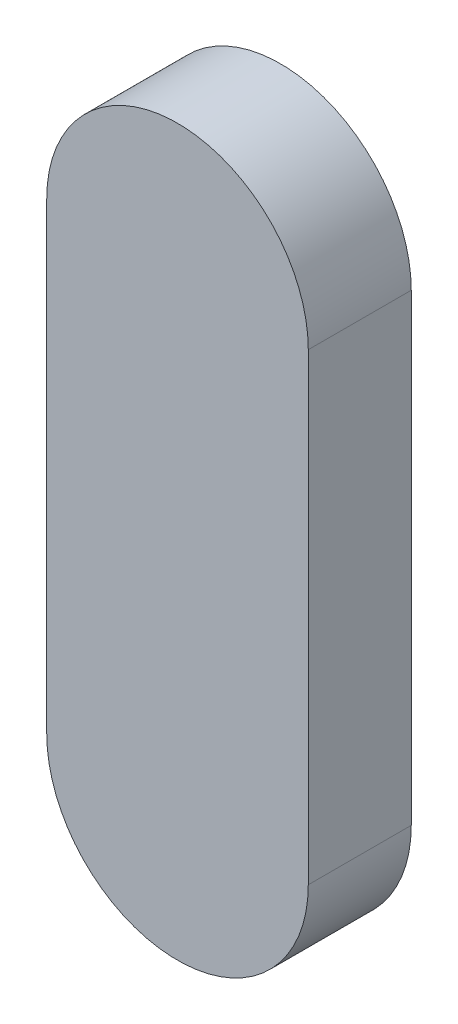
ISO-10303-21;
HEADER;
FILE_DESCRIPTION(('STEP AP214'),'2;1');
FILE_NAME('part.step','',(''),(''),'','','');
FILE_SCHEMA(('AUTOMOTIVE_DESIGN { 1 0 10303 214 1 1 1 1 }'));
ENDSEC;
DATA;
#1=APPLICATION_CONTEXT('core data for automotive mechanical design processes');
#2=APPLICATION_PROTOCOL_DEFINITION('international standard','automotive_design',2000,#1);
#3=PRODUCT_CONTEXT('',#1,'mechanical');
#4=PRODUCT('Part','Part','',(#3));
#5=PRODUCT_RELATED_PRODUCT_CATEGORY('part','',(#4));
#6=PRODUCT_DEFINITION_FORMATION('','',#4);
#7=PRODUCT_DEFINITION_CONTEXT('part definition',#1,'design');
#8=PRODUCT_DEFINITION('design','',#6,#7);
#9=PRODUCT_DEFINITION_SHAPE('','',#8);
#10=(LENGTH_UNIT() NAMED_UNIT(*) SI_UNIT(.MILLI.,.METRE.));
#11=(NAMED_UNIT(*) PLANE_ANGLE_UNIT() SI_UNIT($,.RADIAN.));
#12=(NAMED_UNIT(*) SI_UNIT($,.STERADIAN.) SOLID_ANGLE_UNIT());
#13=UNCERTAINTY_MEASURE_WITH_UNIT(LENGTH_MEASURE(1.E-05),#10,'distance_accuracy_value','');
#14=(GEOMETRIC_REPRESENTATION_CONTEXT(3) GLOBAL_UNCERTAINTY_ASSIGNED_CONTEXT((#13)) GLOBAL_UNIT_ASSIGNED_CONTEXT((#10,
#11,#12)) REPRESENTATION_CONTEXT('',''));
#15=CARTESIAN_POINT('',(0.,0.,0.));
#16=DIRECTION('',(0.,0.,1.));
#17=DIRECTION('',(1.,0.,0.));
#18=AXIS2_PLACEMENT_3D('',#15,#16,#17);
#19=CARTESIAN_POINT('',(151.3275104,87.0514896,0.));
#20=DIRECTION('',(-1.,0.,0.));
#21=DIRECTION('',(0.,1.,0.));
#22=AXIS2_PLACEMENT_3D('',#19,#20,#21);
#23=PLANE('',#22);
#24=DIRECTION('',(0.,1.,0.));
#25=VECTOR('',#24,1.);
#26=CARTESIAN_POINT('',(151.3275104,87.0514896,0.1999996));
#27=LINE('',#26,#25);
#28=CARTESIAN_POINT('',(151.3275104,87.0514896,0.1999996));
#29=VERTEX_POINT('',#28);
#30=CARTESIAN_POINT('',(151.3275104,87.9515132,0.1999996));
#31=VERTEX_POINT('',#30);
#32=EDGE_CURVE('E11',#29,#31,#27,.T.);
#33=ORIENTED_EDGE('',*,*,#32,.F.);
#34=DIRECTION('',(0.,0.,1.));
#35=VECTOR('',#34,1.);
#36=CARTESIAN_POINT('',(151.3275104,87.0514896,0.));
#37=LINE('',#36,#35);
#38=CARTESIAN_POINT('',(151.3275104,87.0514896,0.));
#39=VERTEX_POINT('',#38);
#40=EDGE_CURVE('E24',#39,#29,#37,.T.);
#41=ORIENTED_EDGE('',*,*,#40,.F.);
#42=DIRECTION('',(0.,1.,0.));
#43=VECTOR('',#42,1.);
#44=CARTESIAN_POINT('',(151.3275104,87.0514896,0.));
#45=LINE('',#44,#43);
#46=CARTESIAN_POINT('',(151.3275104,87.9515132,0.));
#47=VERTEX_POINT('',#46);
#48=EDGE_CURVE('E75',#39,#47,#45,.T.);
#49=ORIENTED_EDGE('',*,*,#48,.T.);
#50=DIRECTION('',(0.,0.,1.));
#51=VECTOR('',#50,1.);
#52=CARTESIAN_POINT('',(151.3275104,87.9515132,0.));
#53=LINE('',#52,#51);
#54=EDGE_CURVE('E37',#47,#31,#53,.T.);
#55=ORIENTED_EDGE('',*,*,#54,.T.);
#56=EDGE_LOOP('',(#33,#41,#49,#55));
#57=FACE_BOUND('',#56,.T.);
#58=ADVANCED_FACE('F17',(#57),#23,.F.);
#59=CARTESIAN_POINT('',(151.0735104,87.9515132,0.));
#60=DIRECTION('',(0.,0.,-1.));
#61=DIRECTION('',(1.,-1.11896493820492E-13,0.));
#62=AXIS2_PLACEMENT_3D('',#59,#60,#61);
#63=CYLINDRICAL_SURFACE('',#62,0.253999999999986);
#64=CARTESIAN_POINT('',(151.0735104,87.9515132,0.1999996));
#65=DIRECTION('',(0.,0.,1.));
#66=DIRECTION('',(1.,-1.11896493820492E-13,0.));
#67=AXIS2_PLACEMENT_3D('',#64,#65,#66);
#68=CIRCLE('',#67,0.253999999999986);
#69=CARTESIAN_POINT('',(150.8195104,87.9515132,0.1999996));
#70=VERTEX_POINT('',#69);
#71=EDGE_CURVE('E83',#31,#70,#68,.T.);
#72=ORIENTED_EDGE('',*,*,#71,.F.);
#73=ORIENTED_EDGE('',*,*,#54,.F.);
#74=CARTESIAN_POINT('',(151.0735104,87.9515132,0.));
#75=DIRECTION('',(0.,0.,1.));
#76=DIRECTION('',(1.,-1.11896493820492E-13,0.));
#77=AXIS2_PLACEMENT_3D('',#74,#75,#76);
#78=CIRCLE('',#77,0.253999999999986);
#79=CARTESIAN_POINT('',(150.8195104,87.9515132,0.));
#80=VERTEX_POINT('',#79);
#81=EDGE_CURVE('E81',#47,#80,#78,.T.);
#82=ORIENTED_EDGE('',*,*,#81,.T.);
#83=DIRECTION('',(0.,0.,1.));
#84=VECTOR('',#83,1.);
#85=CARTESIAN_POINT('',(150.8195104,87.9515132,0.));
#86=LINE('',#85,#84);
#87=EDGE_CURVE('E67',#80,#70,#86,.T.);
#88=ORIENTED_EDGE('',*,*,#87,.T.);
#89=EDGE_LOOP('',(#72,#73,#82,#88));
#90=FACE_BOUND('',#89,.T.);
#91=ADVANCED_FACE('F89',(#90),#63,.T.);
#92=CARTESIAN_POINT('',(150.8195104,87.9515132,0.));
#93=DIRECTION('',(1.,0.,0.));
#94=DIRECTION('',(0.,-1.,0.));
#95=AXIS2_PLACEMENT_3D('',#92,#93,#94);
#96=PLANE('',#95);
#97=DIRECTION('',(0.,-1.,0.));
#98=VECTOR('',#97,1.);
#99=CARTESIAN_POINT('',(150.8195104,87.9515132,0.1999996));
#100=LINE('',#99,#98);
#101=CARTESIAN_POINT('',(150.8195104,87.0514896,0.1999996));
#102=VERTEX_POINT('',#101);
#103=EDGE_CURVE('E71',#70,#102,#100,.T.);
#104=ORIENTED_EDGE('',*,*,#103,.F.);
#105=ORIENTED_EDGE('',*,*,#87,.F.);
#106=DIRECTION('',(0.,-1.,0.));
#107=VECTOR('',#106,1.);
#108=CARTESIAN_POINT('',(150.8195104,87.9515132,0.));
#109=LINE('',#108,#107);
#110=CARTESIAN_POINT('',(150.8195104,87.0514896,0.));
#111=VERTEX_POINT('',#110);
#112=EDGE_CURVE('E63',#80,#111,#109,.T.);
#113=ORIENTED_EDGE('',*,*,#112,.T.);
#114=DIRECTION('',(0.,0.,1.));
#115=VECTOR('',#114,1.);
#116=CARTESIAN_POINT('',(150.8195104,87.0514896,0.));
#117=LINE('',#116,#115);
#118=EDGE_CURVE('E53',#111,#102,#117,.T.);
#119=ORIENTED_EDGE('',*,*,#118,.T.);
#120=EDGE_LOOP('',(#104,#105,#113,#119));
#121=FACE_BOUND('',#120,.T.);
#122=ADVANCED_FACE('F66',(#121),#96,.F.);
#123=CARTESIAN_POINT('',(151.0735104,87.0514896,0.));
#124=DIRECTION('',(0.,0.,-1.));
#125=DIRECTION('',(-1.,1.11896493820492E-13,0.));
#126=AXIS2_PLACEMENT_3D('',#123,#124,#125);
#127=CYLINDRICAL_SURFACE('',#126,0.253999999999986);
#128=CARTESIAN_POINT('',(151.0735104,87.0514896,0.1999996));
#129=DIRECTION('',(0.,0.,1.));
#130=DIRECTION('',(-1.,1.11896493820492E-13,0.));
#131=AXIS2_PLACEMENT_3D('',#128,#129,#130);
#132=CIRCLE('',#131,0.253999999999986);
#133=EDGE_CURVE('E59',#102,#29,#132,.T.);
#134=ORIENTED_EDGE('',*,*,#133,.F.);
#135=ORIENTED_EDGE('',*,*,#118,.F.);
#136=CARTESIAN_POINT('',(151.0735104,87.0514896,0.));
#137=DIRECTION('',(0.,0.,1.));
#138=DIRECTION('',(-1.,1.11896493820492E-13,0.));
#139=AXIS2_PLACEMENT_3D('',#136,#137,#138);
#140=CIRCLE('',#139,0.253999999999986);
#141=EDGE_CURVE('E57',#111,#39,#140,.T.);
#142=ORIENTED_EDGE('',*,*,#141,.T.);
#143=ORIENTED_EDGE('',*,*,#40,.T.);
#144=EDGE_LOOP('',(#134,#135,#142,#143));
#145=FACE_BOUND('',#144,.T.);
#146=ADVANCED_FACE('F55',(#145),#127,.T.);
#147=CARTESIAN_POINT('',(151.3275104,87.0514896,0.));
#148=DIRECTION('',(0.,0.,-1.));
#149=DIRECTION('',(-1.,0.,0.));
#150=AXIS2_PLACEMENT_3D('',#147,#148,#149);
#151=PLANE('',#150);
#152=ORIENTED_EDGE('',*,*,#141,.F.);
#153=ORIENTED_EDGE('',*,*,#112,.F.);
#154=ORIENTED_EDGE('',*,*,#81,.F.);
#155=ORIENTED_EDGE('',*,*,#48,.F.);
#156=EDGE_LOOP('',(#152,#153,#154,#155));
#157=FACE_BOUND('',#156,.T.);
#158=ADVANCED_FACE('F74',(#157),#151,.T.);
#159=CARTESIAN_POINT('',(151.3275104,87.0514896,0.1999996));
#160=DIRECTION('',(0.,0.,-1.));
#161=DIRECTION('',(-1.,0.,0.));
#162=AXIS2_PLACEMENT_3D('',#159,#160,#161);
#163=PLANE('',#162);
#164=ORIENTED_EDGE('',*,*,#32,.T.);
#165=ORIENTED_EDGE('',*,*,#71,.T.);
#166=ORIENTED_EDGE('',*,*,#103,.T.);
#167=ORIENTED_EDGE('',*,*,#133,.T.);
#168=EDGE_LOOP('',(#164,#165,#166,#167));
#169=FACE_BOUND('',#168,.T.);
#170=ADVANCED_FACE('F91',(#169),#163,.F.);
#171=CLOSED_SHELL('',(#58,#91,#122,#146,#158,#170));
#172=MANIFOLD_SOLID_BREP('B1',#171);
#173=ADVANCED_BREP_SHAPE_REPRESENTATION('',(#18,#172),#14);
#174=SHAPE_DEFINITION_REPRESENTATION(#9,#173);
ENDSEC;
END-ISO-10303-21;
